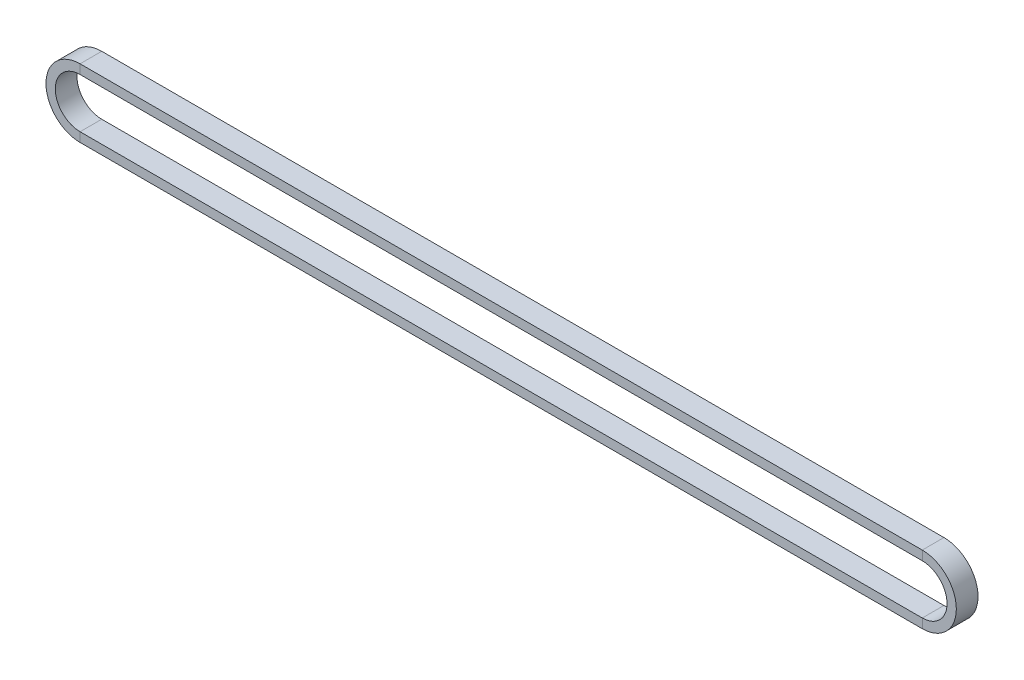
ISO-10303-21;
HEADER;
FILE_DESCRIPTION(('STEP AP214'),'2;1');
FILE_NAME('part.step','',(''),(''),'','','');
FILE_SCHEMA(('AUTOMOTIVE_DESIGN { 1 0 10303 214 1 1 1 1 }'));
ENDSEC;
DATA;
#1=APPLICATION_CONTEXT('core data for automotive mechanical design processes');
#2=APPLICATION_PROTOCOL_DEFINITION('international standard','automotive_design',2000,#1);
#3=PRODUCT_CONTEXT('',#1,'mechanical');
#4=PRODUCT('Part','Part','',(#3));
#5=PRODUCT_RELATED_PRODUCT_CATEGORY('part','',(#4));
#6=PRODUCT_DEFINITION_FORMATION('','',#4);
#7=PRODUCT_DEFINITION_CONTEXT('part definition',#1,'design');
#8=PRODUCT_DEFINITION('design','',#6,#7);
#9=PRODUCT_DEFINITION_SHAPE('','',#8);
#10=(LENGTH_UNIT() NAMED_UNIT(*) SI_UNIT(.MILLI.,.METRE.));
#11=(NAMED_UNIT(*) PLANE_ANGLE_UNIT() SI_UNIT($,.RADIAN.));
#12=(NAMED_UNIT(*) SI_UNIT($,.STERADIAN.) SOLID_ANGLE_UNIT());
#13=UNCERTAINTY_MEASURE_WITH_UNIT(LENGTH_MEASURE(1.E-05),#10,'distance_accuracy_value','');
#14=(GEOMETRIC_REPRESENTATION_CONTEXT(3) GLOBAL_UNCERTAINTY_ASSIGNED_CONTEXT((#13)) GLOBAL_UNIT_ASSIGNED_CONTEXT((#10,
#11,#12)) REPRESENTATION_CONTEXT('',''));
#15=CARTESIAN_POINT('',(0.,0.,0.));
#16=DIRECTION('',(0.,0.,1.));
#17=DIRECTION('',(1.,0.,0.));
#18=AXIS2_PLACEMENT_3D('',#15,#16,#17);
#19=CARTESIAN_POINT('',(0.,55.,-17.5));
#20=DIRECTION('',(0.,0.,1.));
#21=DIRECTION('',(1.,0.,0.));
#22=AXIS2_PLACEMENT_3D('',#19,#20,#21);
#23=PLANE('',#22);
#24=DIRECTION('',(0.,-1.,0.));
#25=VECTOR('',#24,1.);
#26=CARTESIAN_POINT('',(0.,54.9999999999999,-17.5));
#27=LINE('',#26,#25);
#28=CARTESIAN_POINT('',(0.,55.,-17.5));
#29=VERTEX_POINT('',#28);
#30=CARTESIAN_POINT('',(0.,40.,-17.5));
#31=VERTEX_POINT('',#30);
#32=EDGE_CURVE('E158',#29,#31,#27,.T.);
#33=ORIENTED_EDGE('',*,*,#32,.F.);
#34=DIRECTION('',(1.,0.,0.));
#35=VECTOR('',#34,1.);
#36=CARTESIAN_POINT('',(0.,55.,-17.5));
#37=LINE('',#36,#35);
#38=CARTESIAN_POINT('',(1360.,55.,-17.5));
#39=VERTEX_POINT('',#38);
#40=EDGE_CURVE('E157',#29,#39,#37,.T.);
#41=ORIENTED_EDGE('',*,*,#40,.T.);
#42=DIRECTION('',(0.,-1.,0.));
#43=VECTOR('',#42,1.);
#44=CARTESIAN_POINT('',(1360.,55.,-17.5));
#45=LINE('',#44,#43);
#46=CARTESIAN_POINT('',(1360.,40.,-17.5));
#47=VERTEX_POINT('',#46);
#48=EDGE_CURVE('E134',#39,#47,#45,.T.);
#49=ORIENTED_EDGE('',*,*,#48,.T.);
#50=DIRECTION('',(1.,0.,0.));
#51=VECTOR('',#50,1.);
#52=CARTESIAN_POINT('',(0.,40.,-17.5));
#53=LINE('',#52,#51);
#54=EDGE_CURVE('E163',#31,#47,#53,.T.);
#55=ORIENTED_EDGE('',*,*,#54,.F.);
#56=EDGE_LOOP('',(#33,#41,#49,#55));
#57=FACE_BOUND('',#56,.T.);
#58=ADVANCED_FACE('F39',(#57),#23,.F.);
#59=CARTESIAN_POINT('',(1360.,55.,-17.5));
#60=DIRECTION('',(0.,0.,1.));
#61=DIRECTION('',(1.,0.,0.));
#62=AXIS2_PLACEMENT_3D('',#59,#60,#61);
#63=PLANE('',#62);
#64=CARTESIAN_POINT('',(1360.,0.,-17.5));
#65=DIRECTION('',(0.,0.,-1.));
#66=DIRECTION('',(0.,1.,0.));
#67=AXIS2_PLACEMENT_3D('',#64,#65,#66);
#68=CIRCLE('',#67,40.);
#69=CARTESIAN_POINT('',(1360.,-40.,-17.5));
#70=VERTEX_POINT('',#69);
#71=EDGE_CURVE('E124',#47,#70,#68,.T.);
#72=ORIENTED_EDGE('',*,*,#71,.F.);
#73=ORIENTED_EDGE('',*,*,#48,.F.);
#74=CARTESIAN_POINT('',(1360.,0.,-17.5));
#75=DIRECTION('',(0.,0.,-1.));
#76=DIRECTION('',(0.,1.,0.));
#77=AXIS2_PLACEMENT_3D('',#74,#75,#76);
#78=CIRCLE('',#77,55.);
#79=CARTESIAN_POINT('',(1360.,-55.,-17.5));
#80=VERTEX_POINT('',#79);
#81=EDGE_CURVE('E137',#39,#80,#78,.T.);
#82=ORIENTED_EDGE('',*,*,#81,.T.);
#83=DIRECTION('',(0.,1.,0.));
#84=VECTOR('',#83,1.);
#85=CARTESIAN_POINT('',(1360.,-55.,-17.5));
#86=LINE('',#85,#84);
#87=EDGE_CURVE('E154',#80,#70,#86,.T.);
#88=ORIENTED_EDGE('',*,*,#87,.T.);
#89=EDGE_LOOP('',(#72,#73,#82,#88));
#90=FACE_BOUND('',#89,.T.);
#91=ADVANCED_FACE('F136',(#90),#63,.F.);
#92=CARTESIAN_POINT('',(1360.,0.,0.));
#93=DIRECTION('',(0.,0.,-1.));
#94=DIRECTION('',(-1.,0.,0.));
#95=AXIS2_PLACEMENT_3D('',#92,#93,#94);
#96=CYLINDRICAL_SURFACE('',#95,40.);
#97=CARTESIAN_POINT('',(1360.,0.,17.5));
#98=DIRECTION('',(0.,0.,-1.));
#99=DIRECTION('',(0.,1.,0.));
#100=AXIS2_PLACEMENT_3D('',#97,#98,#99);
#101=CIRCLE('',#100,40.);
#102=CARTESIAN_POINT('',(1360.,40.,17.5));
#103=VERTEX_POINT('',#102);
#104=CARTESIAN_POINT('',(1360.,-40.,17.5));
#105=VERTEX_POINT('',#104);
#106=EDGE_CURVE('E118',#103,#105,#101,.T.);
#107=ORIENTED_EDGE('',*,*,#106,.F.);
#108=DIRECTION('',(0.,0.,1.));
#109=VECTOR('',#108,1.);
#110=CARTESIAN_POINT('',(1360.,40.,-17.5));
#111=LINE('',#110,#109);
#112=EDGE_CURVE('E143',#47,#103,#111,.T.);
#113=ORIENTED_EDGE('',*,*,#112,.F.);
#114=ORIENTED_EDGE('',*,*,#71,.T.);
#115=DIRECTION('',(0.,0.,1.));
#116=VECTOR('',#115,1.);
#117=CARTESIAN_POINT('',(1360.,-40.,-17.5));
#118=LINE('',#117,#116);
#119=EDGE_CURVE('E221',#70,#105,#118,.T.);
#120=ORIENTED_EDGE('',*,*,#119,.T.);
#121=EDGE_LOOP('',(#107,#113,#114,#120));
#122=FACE_BOUND('',#121,.T.);
#123=ADVANCED_FACE('F250',(#122),#96,.F.);
#124=CARTESIAN_POINT('',(1360.,55.,17.5));
#125=DIRECTION('',(0.,0.,-1.));
#126=DIRECTION('',(-1.,0.,0.));
#127=AXIS2_PLACEMENT_3D('',#124,#125,#126);
#128=PLANE('',#127);
#129=CARTESIAN_POINT('',(1360.,0.,17.5));
#130=DIRECTION('',(0.,0.,-1.));
#131=DIRECTION('',(0.,1.,0.));
#132=AXIS2_PLACEMENT_3D('',#129,#130,#131);
#133=CIRCLE('',#132,55.);
#134=CARTESIAN_POINT('',(1360.,55.,17.5));
#135=VERTEX_POINT('',#134);
#136=CARTESIAN_POINT('',(1360.,-55.,17.5));
#137=VERTEX_POINT('',#136);
#138=EDGE_CURVE('E176',#135,#137,#133,.T.);
#139=ORIENTED_EDGE('',*,*,#138,.F.);
#140=DIRECTION('',(0.,1.,0.));
#141=VECTOR('',#140,1.);
#142=CARTESIAN_POINT('',(1360.,55.,17.5));
#143=LINE('',#142,#141);
#144=EDGE_CURVE('E167',#103,#135,#143,.T.);
#145=ORIENTED_EDGE('',*,*,#144,.F.);
#146=ORIENTED_EDGE('',*,*,#106,.T.);
#147=DIRECTION('',(0.,-1.,0.));
#148=VECTOR('',#147,1.);
#149=CARTESIAN_POINT('',(1360.,-55.,17.5));
#150=LINE('',#149,#148);
#151=EDGE_CURVE('E201',#105,#137,#150,.T.);
#152=ORIENTED_EDGE('',*,*,#151,.T.);
#153=EDGE_LOOP('',(#139,#145,#146,#152));
#154=FACE_BOUND('',#153,.T.);
#155=ADVANCED_FACE('F200',(#154),#128,.F.);
#156=CARTESIAN_POINT('',(1360.,0.,0.));
#157=DIRECTION('',(0.,0.,-1.));
#158=DIRECTION('',(-1.,0.,0.));
#159=AXIS2_PLACEMENT_3D('',#156,#157,#158);
#160=CYLINDRICAL_SURFACE('',#159,55.);
#161=DIRECTION('',(0.,0.,-1.));
#162=VECTOR('',#161,1.);
#163=CARTESIAN_POINT('',(1360.,-55.,-17.5));
#164=LINE('',#163,#162);
#165=EDGE_CURVE('E151',#137,#80,#164,.T.);
#166=ORIENTED_EDGE('',*,*,#165,.T.);
#167=ORIENTED_EDGE('',*,*,#81,.F.);
#168=DIRECTION('',(0.,0.,-1.));
#169=VECTOR('',#168,1.);
#170=CARTESIAN_POINT('',(1360.,55.,-17.5));
#171=LINE('',#170,#169);
#172=EDGE_CURVE('E150',#135,#39,#171,.T.);
#173=ORIENTED_EDGE('',*,*,#172,.F.);
#174=ORIENTED_EDGE('',*,*,#138,.T.);
#175=EDGE_LOOP('',(#166,#167,#173,#174));
#176=FACE_BOUND('',#175,.T.);
#177=ADVANCED_FACE('F148',(#176),#160,.T.);
#178=CARTESIAN_POINT('',(1360.,-55.,-17.5));
#179=DIRECTION('',(0.,0.,1.));
#180=DIRECTION('',(1.,0.,0.));
#181=AXIS2_PLACEMENT_3D('',#178,#179,#180);
#182=PLANE('',#181);
#183=DIRECTION('',(-1.,0.,0.));
#184=VECTOR('',#183,1.);
#185=CARTESIAN_POINT('',(1360.,-40.,-17.5));
#186=LINE('',#185,#184);
#187=CARTESIAN_POINT('',(0.,-40.,-17.5));
#188=VERTEX_POINT('',#187);
#189=EDGE_CURVE('E105',#70,#188,#186,.T.);
#190=ORIENTED_EDGE('',*,*,#189,.F.);
#191=ORIENTED_EDGE('',*,*,#87,.F.);
#192=DIRECTION('',(-1.,0.,0.));
#193=VECTOR('',#192,1.);
#194=CARTESIAN_POINT('',(1360.,-55.,-17.5));
#195=LINE('',#194,#193);
#196=CARTESIAN_POINT('',(0.,-55.,-17.5));
#197=VERTEX_POINT('',#196);
#198=EDGE_CURVE('E175',#80,#197,#195,.T.);
#199=ORIENTED_EDGE('',*,*,#198,.T.);
#200=DIRECTION('',(0.,1.,0.));
#201=VECTOR('',#200,1.);
#202=CARTESIAN_POINT('',(0.,-55.,-17.5));
#203=LINE('',#202,#201);
#204=EDGE_CURVE('E237',#197,#188,#203,.T.);
#205=ORIENTED_EDGE('',*,*,#204,.T.);
#206=EDGE_LOOP('',(#190,#191,#199,#205));
#207=FACE_BOUND('',#206,.T.);
#208=ADVANCED_FACE('F246',(#207),#182,.F.);
#209=CARTESIAN_POINT('',(1360.,-40.,-17.5));
#210=DIRECTION('',(0.,-1.,0.));
#211=DIRECTION('',(0.,0.,-1.));
#212=AXIS2_PLACEMENT_3D('',#209,#210,#211);
#213=PLANE('',#212);
#214=DIRECTION('',(-1.,0.,0.));
#215=VECTOR('',#214,1.);
#216=CARTESIAN_POINT('',(1360.,-40.,17.5));
#217=LINE('',#216,#215);
#218=CARTESIAN_POINT('',(0.,-40.,17.5));
#219=VERTEX_POINT('',#218);
#220=EDGE_CURVE('E98',#105,#219,#217,.T.);
#221=ORIENTED_EDGE('',*,*,#220,.F.);
#222=ORIENTED_EDGE('',*,*,#119,.F.);
#223=ORIENTED_EDGE('',*,*,#189,.T.);
#224=DIRECTION('',(0.,0.,1.));
#225=VECTOR('',#224,1.);
#226=CARTESIAN_POINT('',(0.,-40.,-17.5));
#227=LINE('',#226,#225);
#228=EDGE_CURVE('E216',#188,#219,#227,.T.);
#229=ORIENTED_EDGE('',*,*,#228,.T.);
#230=EDGE_LOOP('',(#221,#222,#223,#229));
#231=FACE_BOUND('',#230,.T.);
#232=ADVANCED_FACE('F249',(#231),#213,.F.);
#233=CARTESIAN_POINT('',(1360.,-55.,17.5));
#234=DIRECTION('',(0.,0.,-1.));
#235=DIRECTION('',(-1.,0.,0.));
#236=AXIS2_PLACEMENT_3D('',#233,#234,#235);
#237=PLANE('',#236);
#238=DIRECTION('',(-1.,0.,0.));
#239=VECTOR('',#238,1.);
#240=CARTESIAN_POINT('',(1360.,-55.,17.5));
#241=LINE('',#240,#239);
#242=CARTESIAN_POINT('',(0.,-55.,17.5));
#243=VERTEX_POINT('',#242);
#244=EDGE_CURVE('E89',#137,#243,#241,.T.);
#245=ORIENTED_EDGE('',*,*,#244,.F.);
#246=ORIENTED_EDGE('',*,*,#151,.F.);
#247=ORIENTED_EDGE('',*,*,#220,.T.);
#248=DIRECTION('',(0.,-1.,0.));
#249=VECTOR('',#248,1.);
#250=CARTESIAN_POINT('',(0.,-55.,17.5));
#251=LINE('',#250,#249);
#252=EDGE_CURVE('E184',#219,#243,#251,.T.);
#253=ORIENTED_EDGE('',*,*,#252,.T.);
#254=EDGE_LOOP('',(#245,#246,#247,#253));
#255=FACE_BOUND('',#254,.T.);
#256=ADVANCED_FACE('F268',(#255),#237,.F.);
#257=CARTESIAN_POINT('',(1360.,-55.,-17.5));
#258=DIRECTION('',(0.,1.,0.));
#259=DIRECTION('',(0.,0.,1.));
#260=AXIS2_PLACEMENT_3D('',#257,#258,#259);
#261=PLANE('',#260);
#262=DIRECTION('',(0.,0.,-1.));
#263=VECTOR('',#262,1.);
#264=CARTESIAN_POINT('',(0.,-55.,-17.5));
#265=LINE('',#264,#263);
#266=EDGE_CURVE('E177',#243,#197,#265,.T.);
#267=ORIENTED_EDGE('',*,*,#266,.T.);
#268=ORIENTED_EDGE('',*,*,#198,.F.);
#269=ORIENTED_EDGE('',*,*,#165,.F.);
#270=ORIENTED_EDGE('',*,*,#244,.T.);
#271=EDGE_LOOP('',(#267,#268,#269,#270));
#272=FACE_BOUND('',#271,.T.);
#273=ADVANCED_FACE('F260',(#272),#261,.F.);
#274=CARTESIAN_POINT('',(0.,-55.,-17.5));
#275=DIRECTION('',(0.,0.,1.));
#276=DIRECTION('',(1.,0.,0.));
#277=AXIS2_PLACEMENT_3D('',#274,#275,#276);
#278=PLANE('',#277);
#279=CARTESIAN_POINT('',(0.,0.,-17.5));
#280=DIRECTION('',(0.,0.,-1.));
#281=DIRECTION('',(0.,-1.,0.));
#282=AXIS2_PLACEMENT_3D('',#279,#280,#281);
#283=CIRCLE('',#282,40.);
#284=EDGE_CURVE('E213',#188,#31,#283,.T.);
#285=ORIENTED_EDGE('',*,*,#284,.F.);
#286=ORIENTED_EDGE('',*,*,#204,.F.);
#287=CARTESIAN_POINT('',(0.,0.,-17.5));
#288=DIRECTION('',(0.,0.,-1.));
#289=DIRECTION('',(0.,-1.,0.));
#290=AXIS2_PLACEMENT_3D('',#287,#288,#289);
#291=CIRCLE('',#290,55.);
#292=EDGE_CURVE('E179',#197,#29,#291,.T.);
#293=ORIENTED_EDGE('',*,*,#292,.T.);
#294=ORIENTED_EDGE('',*,*,#32,.T.);
#295=EDGE_LOOP('',(#285,#286,#293,#294));
#296=FACE_BOUND('',#295,.T.);
#297=ADVANCED_FACE('F258',(#296),#278,.F.);
#298=CARTESIAN_POINT('',(0.,0.,0.));
#299=DIRECTION('',(0.,0.,-1.));
#300=DIRECTION('',(-1.,0.,0.));
#301=AXIS2_PLACEMENT_3D('',#298,#299,#300);
#302=CYLINDRICAL_SURFACE('',#301,40.);
#303=CARTESIAN_POINT('',(0.,0.,17.5));
#304=DIRECTION('',(0.,0.,-1.));
#305=DIRECTION('',(0.,-1.,0.));
#306=AXIS2_PLACEMENT_3D('',#303,#304,#305);
#307=CIRCLE('',#306,40.);
#308=CARTESIAN_POINT('',(0.,40.,17.5));
#309=VERTEX_POINT('',#308);
#310=EDGE_CURVE('E65',#219,#309,#307,.T.);
#311=ORIENTED_EDGE('',*,*,#310,.F.);
#312=ORIENTED_EDGE('',*,*,#228,.F.);
#313=ORIENTED_EDGE('',*,*,#284,.T.);
#314=DIRECTION('',(0.,0.,1.));
#315=VECTOR('',#314,1.);
#316=CARTESIAN_POINT('',(0.,39.9999999999999,-17.5));
#317=LINE('',#316,#315);
#318=EDGE_CURVE('E210',#31,#309,#317,.T.);
#319=ORIENTED_EDGE('',*,*,#318,.T.);
#320=EDGE_LOOP('',(#311,#312,#313,#319));
#321=FACE_BOUND('',#320,.T.);
#322=ADVANCED_FACE('F255',(#321),#302,.F.);
#323=CARTESIAN_POINT('',(0.,-55.,17.5));
#324=DIRECTION('',(0.,0.,-1.));
#325=DIRECTION('',(-1.,0.,0.));
#326=AXIS2_PLACEMENT_3D('',#323,#324,#325);
#327=PLANE('',#326);
#328=CARTESIAN_POINT('',(0.,0.,17.5));
#329=DIRECTION('',(0.,0.,-1.));
#330=DIRECTION('',(0.,-1.,0.));
#331=AXIS2_PLACEMENT_3D('',#328,#329,#330);
#332=CIRCLE('',#331,55.);
#333=CARTESIAN_POINT('',(0.,55.,17.5));
#334=VERTEX_POINT('',#333);
#335=EDGE_CURVE('E57',#243,#334,#332,.T.);
#336=ORIENTED_EDGE('',*,*,#335,.F.);
#337=ORIENTED_EDGE('',*,*,#252,.F.);
#338=ORIENTED_EDGE('',*,*,#310,.T.);
#339=DIRECTION('',(0.,1.,0.));
#340=VECTOR('',#339,1.);
#341=CARTESIAN_POINT('',(0.,54.9999999999999,17.5));
#342=LINE('',#341,#340);
#343=EDGE_CURVE('E190',#309,#334,#342,.T.);
#344=ORIENTED_EDGE('',*,*,#343,.T.);
#345=EDGE_LOOP('',(#336,#337,#338,#344));
#346=FACE_BOUND('',#345,.T.);
#347=ADVANCED_FACE('F266',(#346),#327,.F.);
#348=CARTESIAN_POINT('',(0.,0.,0.));
#349=DIRECTION('',(0.,0.,-1.));
#350=DIRECTION('',(-1.,0.,0.));
#351=AXIS2_PLACEMENT_3D('',#348,#349,#350);
#352=CYLINDRICAL_SURFACE('',#351,55.);
#353=DIRECTION('',(0.,0.,-1.));
#354=VECTOR('',#353,1.);
#355=CARTESIAN_POINT('',(0.,54.9999999999999,-17.5));
#356=LINE('',#355,#354);
#357=EDGE_CURVE('E43',#334,#29,#356,.T.);
#358=ORIENTED_EDGE('',*,*,#357,.T.);
#359=ORIENTED_EDGE('',*,*,#292,.F.);
#360=ORIENTED_EDGE('',*,*,#266,.F.);
#361=ORIENTED_EDGE('',*,*,#335,.T.);
#362=EDGE_LOOP('',(#358,#359,#360,#361));
#363=FACE_BOUND('',#362,.T.);
#364=ADVANCED_FACE('F194',(#363),#352,.T.);
#365=CARTESIAN_POINT('',(0.,40.,-17.5));
#366=DIRECTION('',(0.,1.,0.));
#367=DIRECTION('',(0.,0.,1.));
#368=AXIS2_PLACEMENT_3D('',#365,#366,#367);
#369=PLANE('',#368);
#370=ORIENTED_EDGE('',*,*,#54,.T.);
#371=ORIENTED_EDGE('',*,*,#112,.T.);
#372=DIRECTION('',(1.,0.,0.));
#373=VECTOR('',#372,1.);
#374=CARTESIAN_POINT('',(0.,40.,17.5));
#375=LINE('',#374,#373);
#376=EDGE_CURVE('E49',#309,#103,#375,.T.);
#377=ORIENTED_EDGE('',*,*,#376,.F.);
#378=ORIENTED_EDGE('',*,*,#318,.F.);
#379=EDGE_LOOP('',(#370,#371,#377,#378));
#380=FACE_BOUND('',#379,.T.);
#381=ADVANCED_FACE('F252',(#380),#369,.F.);
#382=CARTESIAN_POINT('',(0.,55.,17.5));
#383=DIRECTION('',(0.,0.,-1.));
#384=DIRECTION('',(-1.,0.,0.));
#385=AXIS2_PLACEMENT_3D('',#382,#383,#384);
#386=PLANE('',#385);
#387=ORIENTED_EDGE('',*,*,#376,.T.);
#388=ORIENTED_EDGE('',*,*,#144,.T.);
#389=DIRECTION('',(1.,0.,0.));
#390=VECTOR('',#389,1.);
#391=CARTESIAN_POINT('',(0.,55.,17.5));
#392=LINE('',#391,#390);
#393=EDGE_CURVE('E11',#334,#135,#392,.T.);
#394=ORIENTED_EDGE('',*,*,#393,.F.);
#395=ORIENTED_EDGE('',*,*,#343,.F.);
#396=EDGE_LOOP('',(#387,#388,#394,#395));
#397=FACE_BOUND('',#396,.T.);
#398=ADVANCED_FACE('F198',(#397),#386,.F.);
#399=CARTESIAN_POINT('',(0.,55.,-17.5));
#400=DIRECTION('',(0.,-1.,0.));
#401=DIRECTION('',(0.,0.,-1.));
#402=AXIS2_PLACEMENT_3D('',#399,#400,#401);
#403=PLANE('',#402);
#404=ORIENTED_EDGE('',*,*,#393,.T.);
#405=ORIENTED_EDGE('',*,*,#172,.T.);
#406=ORIENTED_EDGE('',*,*,#40,.F.);
#407=ORIENTED_EDGE('',*,*,#357,.F.);
#408=EDGE_LOOP('',(#404,#405,#406,#407));
#409=FACE_BOUND('',#408,.T.);
#410=ADVANCED_FACE('F41',(#409),#403,.F.);
#411=CLOSED_SHELL('',(#58,#91,#123,#155,#177,#208,#232,#256,#273,#297,#322,#347,#364,#381,#398,#410));
#412=MANIFOLD_SOLID_BREP('B2',#411);
#413=ADVANCED_BREP_SHAPE_REPRESENTATION('',(#18,#412),#14);
#414=SHAPE_DEFINITION_REPRESENTATION(#9,#413);
ENDSEC;
END-ISO-10303-21;
